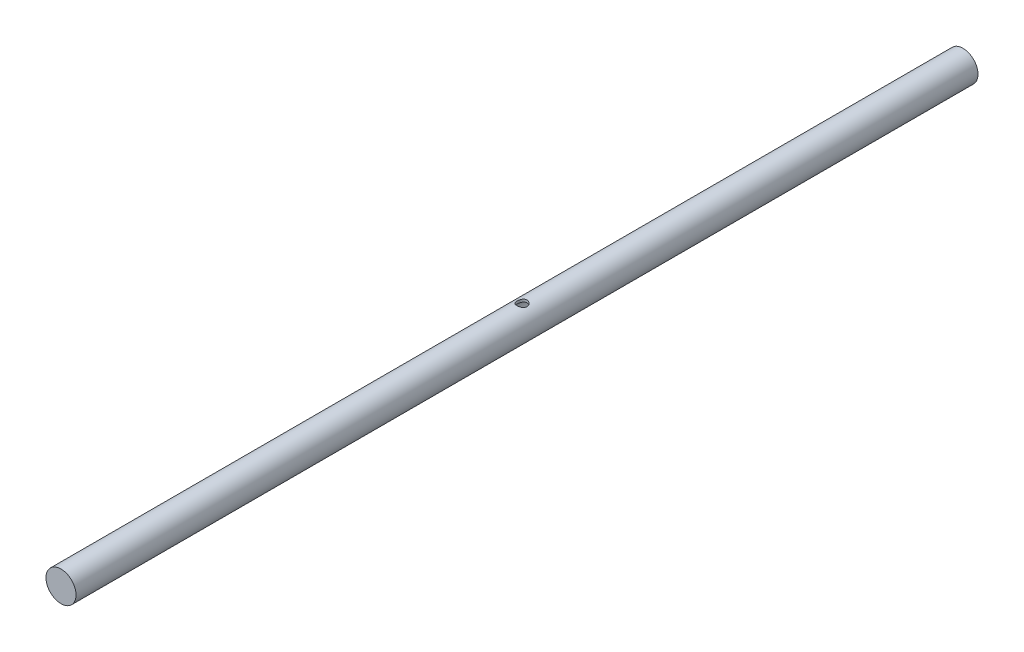
ISO-10303-21;
HEADER;
FILE_DESCRIPTION(('STEP AP214'),'2;1');
FILE_NAME('part.step','',(''),(''),'','','');
FILE_SCHEMA(('AUTOMOTIVE_DESIGN { 1 0 10303 214 1 1 1 1 }'));
ENDSEC;
DATA;
#1=APPLICATION_CONTEXT('core data for automotive mechanical design processes');
#2=APPLICATION_PROTOCOL_DEFINITION('international standard','automotive_design',2000,#1);
#3=PRODUCT_CONTEXT('',#1,'mechanical');
#4=PRODUCT('Part','Part','',(#3));
#5=PRODUCT_RELATED_PRODUCT_CATEGORY('part','',(#4));
#6=PRODUCT_DEFINITION_FORMATION('','',#4);
#7=PRODUCT_DEFINITION_CONTEXT('part definition',#1,'design');
#8=PRODUCT_DEFINITION('design','',#6,#7);
#9=PRODUCT_DEFINITION_SHAPE('','',#8);
#10=(LENGTH_UNIT() NAMED_UNIT(*) SI_UNIT(.MILLI.,.METRE.));
#11=(NAMED_UNIT(*) PLANE_ANGLE_UNIT() SI_UNIT($,.RADIAN.));
#12=(NAMED_UNIT(*) SI_UNIT($,.STERADIAN.) SOLID_ANGLE_UNIT());
#13=UNCERTAINTY_MEASURE_WITH_UNIT(LENGTH_MEASURE(1.E-05),#10,'distance_accuracy_value','');
#14=(GEOMETRIC_REPRESENTATION_CONTEXT(3) GLOBAL_UNCERTAINTY_ASSIGNED_CONTEXT((#13)) GLOBAL_UNIT_ASSIGNED_CONTEXT((#10,
#11,#12)) REPRESENTATION_CONTEXT('',''));
#15=CARTESIAN_POINT('',(0.,0.,0.));
#16=DIRECTION('',(0.,0.,1.));
#17=DIRECTION('',(1.,0.,0.));
#18=AXIS2_PLACEMENT_3D('',#15,#16,#17);
#19=CARTESIAN_POINT('',(0.,0.,228.6));
#20=DIRECTION('',(0.,0.,-1.));
#21=DIRECTION('',(-1.,0.,0.));
#22=AXIS2_PLACEMENT_3D('',#19,#20,#21);
#23=CYLINDRICAL_SURFACE('',#22,3.81);
#24=CARTESIAN_POINT('',(0.,0.,228.6));
#25=DIRECTION('',(0.,0.,1.));
#26=DIRECTION('',(1.,0.,0.));
#27=AXIS2_PLACEMENT_3D('',#24,#25,#26);
#28=CIRCLE('',#27,3.81);
#29=CARTESIAN_POINT('',(3.81,0.,228.6));
#30=VERTEX_POINT('',#29);
#31=EDGE_CURVE('E10',#30,#30,#28,.T.);
#32=ORIENTED_EDGE('',*,*,#31,.F.);
#33=EDGE_LOOP('',(#32));
#34=FACE_BOUND('',#33,.T.);
#35=CARTESIAN_POINT('',(0.,0.,0.));
#36=DIRECTION('',(0.,0.,1.));
#37=DIRECTION('',(1.,0.,0.));
#38=AXIS2_PLACEMENT_3D('',#35,#36,#37);
#39=CIRCLE('',#38,3.81);
#40=CARTESIAN_POINT('',(3.81,0.,0.));
#41=VERTEX_POINT('',#40);
#42=EDGE_CURVE('E43',#41,#41,#39,.T.);
#43=ORIENTED_EDGE('',*,*,#42,.T.);
#44=EDGE_LOOP('',(#43));
#45=FACE_BOUND('',#44,.T.);
#46=CARTESIAN_POINT('',(0.,3.81,110.49));
#47=CARTESIAN_POINT('',(-0.0692954708661389,3.81000019432199,110.489999677761));
#48=CARTESIAN_POINT('',(-0.138588997063959,3.80809207274582,110.495689937982));
#49=CARTESIAN_POINT('',(-0.275135036308676,3.80066816958166,110.518230968198));
#50=CARTESIAN_POINT('',(-0.3423873367109,3.79515201346734,110.535082896815));
#51=CARTESIAN_POINT('',(-0.472862642667256,3.78111141041182,110.579305439098));
#52=CARTESIAN_POINT('',(-0.536092178875263,3.77259199418184,110.606658469323));
#53=CARTESIAN_POINT('',(-0.657066169742762,3.75341446061024,110.671027289505));
#54=CARTESIAN_POINT('',(-0.714809539337557,3.74275592148078,110.708044985553));
#55=CARTESIAN_POINT('',(-0.825171927278282,3.72000899942616,110.792038772171));
#56=CARTESIAN_POINT('',(-0.877574699378859,3.70788636709006,110.839289667511));
#57=CARTESIAN_POINT('',(-0.973877519731653,3.68376599774564,110.941824286477));
#58=CARTESIAN_POINT('',(-1.01777569557162,3.67176828878997,110.997109774359));
#59=CARTESIAN_POINT('',(-1.09705767662939,3.64887932246137,111.1160910963));
#60=CARTESIAN_POINT('',(-1.13216036994072,3.63802979880123,111.17998304946));
#61=CARTESIAN_POINT('',(-1.19102996982472,3.61918637881623,111.313183639962));
#62=CARTESIAN_POINT('',(-1.2148003356812,3.61119161124147,111.382490616797));
#63=CARTESIAN_POINT('',(-1.24951929611664,3.59932355152109,111.522094991301));
#64=CARTESIAN_POINT('',(-1.26087307930515,3.59532041627406,111.592280254781));
#65=CARTESIAN_POINT('',(-1.27170322663479,3.59150483919474,111.733664967778));
#66=CARTESIAN_POINT('',(-1.27118326103799,3.59169110238867,111.804864097101));
#67=CARTESIAN_POINT('',(-1.25859527770334,3.59611949060389,111.942799520664));
#68=CARTESIAN_POINT('',(-1.24705606972208,3.60017588151767,112.009591071707));
#69=CARTESIAN_POINT('',(-1.21361982681876,3.6115835531018,112.140229642901));
#70=CARTESIAN_POINT('',(-1.19172155177168,3.61893522825817,112.204076309503));
#71=CARTESIAN_POINT('',(-1.13784260373647,3.63623747136686,112.328214191981));
#72=CARTESIAN_POINT('',(-1.10570524185822,3.64622798557259,112.388431592346));
#73=CARTESIAN_POINT('',(-1.03236916500499,3.66766549391172,112.502786053515));
#74=CARTESIAN_POINT('',(-0.991167832702291,3.67911290833888,112.556921351205));
#75=CARTESIAN_POINT('',(-0.898333652506452,3.70290508043031,112.660546329664));
#76=CARTESIAN_POINT('',(-0.846268500596929,3.7152654848065,112.709645922026));
#77=CARTESIAN_POINT('',(-0.734491253861994,3.73896811751536,112.798518708662));
#78=CARTESIAN_POINT('',(-0.674778426489242,3.75031024813345,112.838291008469));
#79=CARTESIAN_POINT('',(-0.54857346856876,3.77084727080998,112.907694301299));
#80=CARTESIAN_POINT('',(-0.482019961048746,3.7800197451021,112.937220774003));
#81=CARTESIAN_POINT('',(-0.344511735872921,3.79502120273432,112.984538030924));
#82=CARTESIAN_POINT('',(-0.273558556456788,3.80085134741697,113.002332891788));
#83=CARTESIAN_POINT('',(-0.132567463502212,3.80831886380729,113.024990695848));
#84=CARTESIAN_POINT('',(-0.0626231918283502,3.81012702328835,113.030380757649));
#85=CARTESIAN_POINT('',(0.0771843388495069,3.80985906422431,113.02957750453));
#86=CARTESIAN_POINT('',(0.147047609535962,3.8077836013259,113.023386144826));
#87=CARTESIAN_POINT('',(0.282600230206409,3.80009431390722,113.000012877175));
#88=CARTESIAN_POINT('',(0.348351864680254,3.79458472363214,112.983154518317));
#89=CARTESIAN_POINT('',(0.476067067396061,3.78068645474189,112.939330325527));
#90=CARTESIAN_POINT('',(0.538030151405935,3.77229740899277,112.912363202676));
#91=CARTESIAN_POINT('',(0.658226136419463,3.75321742734858,112.848300551562));
#92=CARTESIAN_POINT('',(0.716318048205781,3.74247174739848,112.81095726653));
#93=CARTESIAN_POINT('',(0.825582334272199,3.71989672473653,112.727493429483));
#94=CARTESIAN_POINT('',(0.876752587100389,3.70806705164161,112.68137019684));
#95=CARTESIAN_POINT('',(0.973140684914008,3.68397596935165,112.579176986222));
#96=CARTESIAN_POINT('',(1.01798243094213,3.67171936581033,112.522750281803));
#97=CARTESIAN_POINT('',(1.09760705335094,3.6487096608428,112.40291010888));
#98=CARTESIAN_POINT('',(1.13238984587239,3.63795657195143,112.339496582135));
#99=CARTESIAN_POINT('',(1.19074810162878,3.61927637575057,112.207455270582));
#100=CARTESIAN_POINT('',(1.21434622784958,3.61134356207083,112.138838359456));
#101=CARTESIAN_POINT('',(1.24954622678439,3.59931757029191,111.998279114444));
#102=CARTESIAN_POINT('',(1.26115350379151,3.59522266252022,111.926338293936));
#103=CARTESIAN_POINT('',(1.27162087874623,3.59153280770205,111.785149688028));
#104=CARTESIAN_POINT('',(1.27110522678167,3.59171748326917,111.715953427836));
#105=CARTESIAN_POINT('',(1.25887771267984,3.59602112676311,111.578688354849));
#106=CARTESIAN_POINT('',(1.24716651691241,3.60013986053089,111.510619475197));
#107=CARTESIAN_POINT('',(1.21332220267427,3.61168345867212,111.378827707987));
#108=CARTESIAN_POINT('',(1.19139124943971,3.61904404488546,111.315046832244));
#109=CARTESIAN_POINT('',(1.13789379451488,3.63621826499455,111.192021193188));
#110=CARTESIAN_POINT('',(1.10632515406334,3.64603244329509,111.132777440391));
#111=CARTESIAN_POINT('',(1.03284107958096,3.66754193117078,111.017705739198));
#112=CARTESIAN_POINT('',(0.990534268311023,3.67930063785514,110.962139642589));
#113=CARTESIAN_POINT('',(0.897436461582278,3.70310862479731,110.858693937002));
#114=CARTESIAN_POINT('',(0.846643067253385,3.71515798638713,110.810816508876));
#115=CARTESIAN_POINT('',(0.735636777289276,3.73875338767441,110.722226596393));
#116=CARTESIAN_POINT('',(0.675133922144658,3.75026150887596,110.681866078356));
#117=CARTESIAN_POINT('',(0.547823843906417,3.77096008789217,110.61193215536));
#118=CARTESIAN_POINT('',(0.481018238028086,3.78015113803071,110.582355992679));
#119=CARTESIAN_POINT('',(0.346066931945243,3.79483004137048,110.536073526739));
#120=CARTESIAN_POINT('',(0.278114452249042,3.80046499776604,110.518851267846));
#121=CARTESIAN_POINT('',(0.140106928333016,3.80804936971562,110.49581624354));
#122=CARTESIAN_POINT('',(0.0700524704723089,3.80999980355519,110.490000325759));
#123=CARTESIAN_POINT('',(0.,3.81,110.49));
#124=B_SPLINE_CURVE_WITH_KNOTS('',3,(#46,#47,#48,#49,#50,#51,#52,#53,#54,#55,#56,#57,#58,#59,
#60,#61,#62,#63,#64,#65,#66,#67,#68,#69,#70,#71,#72,#73,#74,#75,#76,#77,#78,#79,#80,#81,#82,#83,
#84,#85,#86,#87,#88,#89,#90,#91,#92,#93,#94,#95,#96,#97,#98,#99,#100,#101,#102,#103,#104,#105,
#106,#107,#108,#109,#110,#111,#112,#113,#114,#115,#116,#117,#118,#119,#120,#121,#122,#123),
.UNSPECIFIED.,.T.,.F.,(4,2,2,2,2,2,2,2,2,2,2,2,2,2,2,2,2,2,2,2,2,2,2,2,2,2,2,2,2,2,2,2,2,2,2,2,
2,2,4),(0.,0.207628624653035,0.415278805289754,0.622582794545249,0.829927699804859,
1.04374549039101,1.25761030275164,1.47762448725809,1.697571467599,1.9101044569214,
2.12257175164109,2.32532969720129,2.52811192186463,2.73415977367016,2.94026720248923,
3.15713498380434,3.37402355377606,3.59306375175955,3.81202779474056,4.02150050632467,
4.23093785718505,4.43430860632332,4.63770529510813,4.84645207801547,5.05526269643803,
5.27356099058557,5.49186110458446,5.70971697559999,5.9274746157642,6.1340449590161,
6.34060300776247,6.54323795592131,6.74591790483493,6.95744184698593,7.169025681272,
7.38885569260579,7.60862945063621,7.81858429134745,8.02848109868439),.UNSPECIFIED.);
#125=CARTESIAN_POINT('',(0.,3.81,110.49));
#126=VERTEX_POINT('',#125);
#127=EDGE_CURVE('E53',#126,#126,#124,.T.);
#128=ORIENTED_EDGE('',*,*,#127,.F.);
#129=EDGE_LOOP('',(#128));
#130=FACE_BOUND('',#129,.T.);
#131=ADVANCED_FACE('F31',(#34,#45,#130),#23,.T.);
#132=CARTESIAN_POINT('',(0.,0.,228.6));
#133=DIRECTION('',(0.,0.,-1.));
#134=DIRECTION('',(-1.,0.,0.));
#135=AXIS2_PLACEMENT_3D('',#132,#133,#134);
#136=CYLINDRICAL_SURFACE('',#135,3.175);
#137=CARTESIAN_POINT('',(0.,0.,0.));
#138=DIRECTION('',(0.,0.,1.));
#139=DIRECTION('',(1.,0.,0.));
#140=AXIS2_PLACEMENT_3D('',#137,#138,#139);
#141=CIRCLE('',#140,3.175);
#142=CARTESIAN_POINT('',(3.175,0.,0.));
#143=VERTEX_POINT('',#142);
#144=EDGE_CURVE('E50',#143,#143,#141,.T.);
#145=ORIENTED_EDGE('',*,*,#144,.F.);
#146=EDGE_LOOP('',(#145));
#147=FACE_BOUND('',#146,.T.);
#148=CARTESIAN_POINT('',(0.,0.,227.965));
#149=DIRECTION('',(0.,0.,1.));
#150=DIRECTION('',(1.,0.,0.));
#151=AXIS2_PLACEMENT_3D('',#148,#149,#150);
#152=CIRCLE('',#151,3.175);
#153=CARTESIAN_POINT('',(3.175,0.,227.965));
#154=VERTEX_POINT('',#153);
#155=EDGE_CURVE('E48',#154,#154,#152,.T.);
#156=ORIENTED_EDGE('',*,*,#155,.T.);
#157=EDGE_LOOP('',(#156));
#158=FACE_BOUND('',#157,.T.);
#159=CARTESIAN_POINT('',(0.,3.175,110.49));
#160=CARTESIAN_POINT('',(-0.0682580584562358,3.17499537229199,110.490006255908));
#161=CARTESIAN_POINT('',(-0.136634578197577,3.17277301884902,110.495535772576));
#162=CARTESIAN_POINT('',(-0.271460265065364,3.16409992718907,110.517462291736));
#163=CARTESIAN_POINT('',(-0.337903678751394,3.15763769473787,110.53388883722));
#164=CARTESIAN_POINT('',(-0.466695740931904,3.1411812285033,110.576916309567));
#165=CARTESIAN_POINT('',(-0.529057020126772,3.13119856591186,110.603483927348));
#166=CARTESIAN_POINT('',(-0.648380701158516,3.10868447855509,110.665907175062));
#167=CARTESIAN_POINT('',(-0.705344967736882,3.09615393885866,110.701759580874));
#168=CARTESIAN_POINT('',(-0.815023139807205,3.06915112718216,110.783519541586));
#169=CARTESIAN_POINT('',(-0.867449543069393,3.05461858550036,110.829792726713));
#170=CARTESIAN_POINT('',(-0.964041128038306,3.02552466335433,110.930309002208));
#171=CARTESIAN_POINT('',(-1.0082022680298,3.01096327228158,110.984555968729));
#172=CARTESIAN_POINT('',(-1.08894535023098,2.98273972791181,111.102411824604));
#173=CARTESIAN_POINT('',(-1.12510251305913,2.96914643637744,111.166329918625));
#174=CARTESIAN_POINT('',(-1.18602424658859,2.94534365963613,111.299965612997));
#175=CARTESIAN_POINT('',(-1.21079422832151,2.93513256790052,111.369680440184));
#176=CARTESIAN_POINT('',(-1.24707575285638,2.9198973711462,111.509627331831));
#177=CARTESIAN_POINT('',(-1.25913766828659,2.91465901925809,111.579692534591));
#178=CARTESIAN_POINT('',(-1.27137983064142,2.90934142571206,111.721033223925));
#179=CARTESIAN_POINT('',(-1.2715659203589,2.90925964706958,111.792308098087));
#180=CARTESIAN_POINT('',(-1.26046824836539,2.91408167677796,111.928755486376));
#181=CARTESIAN_POINT('',(-1.24998182458376,2.91863891149416,111.99400747865));
#182=CARTESIAN_POINT('',(-1.21916626898912,2.93164379130976,112.121733818064));
#183=CARTESIAN_POINT('',(-1.19883541970094,2.94009211524262,112.18420767845));
#184=CARTESIAN_POINT('',(-1.14852115516993,2.96011273031217,112.306111325984));
#185=CARTESIAN_POINT('',(-1.11834921257023,2.971745258433,112.3654529668));
#186=CARTESIAN_POINT('',(-1.04934160256496,2.9968070390758,112.47844904339));
#187=CARTESIAN_POINT('',(-1.01050268123904,3.01023696565099,112.532101331971));
#188=CARTESIAN_POINT('',(-0.921734630653571,3.03864477831342,112.636560177789));
#189=CARTESIAN_POINT('',(-0.871180288986358,3.05366207259856,112.686826143198));
#190=CARTESIAN_POINT('',(-0.762199661418174,3.08266988848509,112.778339643531));
#191=CARTESIAN_POINT('',(-0.703771811487364,3.09666020522781,112.819585382356));
#192=CARTESIAN_POINT('',(-0.579169309404706,3.12238822602988,112.892597079109));
#193=CARTESIAN_POINT('',(-0.51286441200501,3.13407596510588,112.92415964856));
#194=CARTESIAN_POINT('',(-0.375300091081632,3.15350415988762,112.975496591785));
#195=CARTESIAN_POINT('',(-0.304043204999547,3.16124662048613,112.995276953849));
#196=CARTESIAN_POINT('',(-0.163128888630971,3.17154648586888,113.021394667592));
#197=CARTESIAN_POINT('',(-0.0936264916808184,3.17438370604281,113.028458508451));
#198=CARTESIAN_POINT('',(0.0456217717279634,3.17543483854251,113.031087818836));
#199=CARTESIAN_POINT('',(0.115367570397193,3.17364994924755,113.026656268783));
#200=CARTESIAN_POINT('',(0.249829789342465,3.16584055085483,113.006954737129));
#201=CARTESIAN_POINT('',(0.314631382277429,3.16001013504407,112.992180682477));
#202=CARTESIAN_POINT('',(0.440775996818597,3.14489745292492,112.952888325223));
#203=CARTESIAN_POINT('',(0.502118572992777,3.13561474321397,112.92836877091));
#204=CARTESIAN_POINT('',(0.621715028993605,3.11414537679465,112.869481563303));
#205=CARTESIAN_POINT('',(0.679817044449682,3.10187858147175,112.834835625253));
#206=CARTESIAN_POINT('',(0.789586680441563,3.07577086613408,112.75698789432));
#207=CARTESIAN_POINT('',(0.841251708883316,3.06192931625022,112.713782672744));
#208=CARTESIAN_POINT('',(0.940259132323301,3.03304649700201,112.616697541777));
#209=CARTESIAN_POINT('',(0.987090947966852,3.01798635304908,112.562301201144));
#210=CARTESIAN_POINT('',(1.07108701035771,2.98920962302379,112.446155547289));
#211=CARTESIAN_POINT('',(1.10824966394932,2.97549325859334,112.384405024784));
#212=CARTESIAN_POINT('',(1.17208776372659,2.95093580441395,112.254371823933));
#213=CARTESIAN_POINT('',(1.19865812752938,2.9401238561184,112.1860316605));
#214=CARTESIAN_POINT('',(1.23970809951287,2.92305532658486,112.045284131161));
#215=CARTESIAN_POINT('',(1.25419663134602,2.91679538366959,111.972879809309));
#216=CARTESIAN_POINT('',(1.26981941697179,2.91002567155453,111.831673782373));
#217=CARTESIAN_POINT('',(1.27183964726232,2.90913452340189,111.762987776858));
#218=CARTESIAN_POINT('',(1.26479500614123,2.91220420881017,111.626304015352));
#219=CARTESIAN_POINT('',(1.25573154232525,2.91616442626244,111.558306173072));
#220=CARTESIAN_POINT('',(1.22750031750757,2.92815422165178,111.427684059442));
#221=CARTESIAN_POINT('',(1.20874630841757,2.9360166821043,111.364953625735));
#222=CARTESIAN_POINT('',(1.16205345979179,2.95480740782762,111.243504570195));
#223=CARTESIAN_POINT('',(1.13411208368507,2.96573651965814,111.184787061719));
#224=CARTESIAN_POINT('',(1.06798920435243,2.99020617098852,111.069367891763));
#225=CARTESIAN_POINT('',(1.02931298782627,3.00386040268909,111.012974144467));
#226=CARTESIAN_POINT('',(0.943541495737397,3.03189515776371,110.907199243576));
#227=CARTESIAN_POINT('',(0.896443682609505,3.04627589910738,110.857820211699));
#228=CARTESIAN_POINT('',(0.791530996483013,3.07526415100495,110.764191188178));
#229=CARTESIAN_POINT('',(0.733219260727799,3.08982591305988,110.72048131012));
#230=CARTESIAN_POINT('',(0.609536703381475,3.1165825826321,110.643455977935));
#231=CARTESIAN_POINT('',(0.544162617887502,3.12877638843995,110.610145357783));
#232=CARTESIAN_POINT('',(0.409408669684461,3.14921718908072,110.555644893354));
#233=CARTESIAN_POINT('',(0.340126077569512,3.15753345539943,110.534240879539));
#234=CARTESIAN_POINT('',(0.198676606888578,3.16956634442947,110.503564158194));
#235=CARTESIAN_POINT('',(0.126519638920411,3.1732975617973,110.494252952668));
#236=CARTESIAN_POINT('',(0.0361393091607404,3.17484696185127,110.490383933079));
#237=CARTESIAN_POINT('',(0.0180738073503816,3.17500122535427,110.48999834352));
#238=CARTESIAN_POINT('',(0.,3.175,110.49));
#239=B_SPLINE_CURVE_WITH_KNOTS('',3,(#159,#160,#161,#162,#163,#164,#165,#166,#167,#168,#169,
#170,#171,#172,#173,#174,#175,#176,#177,#178,#179,#180,#181,#182,#183,#184,#185,#186,#187,#188,
#189,#190,#191,#192,#193,#194,#195,#196,#197,#198,#199,#200,#201,#202,#203,#204,#205,#206,#207,
#208,#209,#210,#211,#212,#213,#214,#215,#216,#217,#218,#219,#220,#221,#222,#223,#224,#225,#226,
#227,#228,#229,#230,#231,#232,#233,#234,#235,#236,#237,#238),.UNSPECIFIED.,.T.,.F.,(4,2,2,2,2,2,
2,2,2,2,2,2,2,2,2,2,2,2,2,2,2,2,2,2,2,2,2,2,2,2,2,2,2,2,2,2,2,2,2,4),(0.,0.2047258973121,
0.410009108865039,0.614623775494461,0.819167485156698,1.03249337379753,1.24592330783353,
1.46885189350203,1.691674436801,1.90439106871107,2.11700304526211,2.31481838534873,
2.51266824907591,2.71455595199748,2.91651957930747,3.13409551733464,3.35171473953232,
3.57363339858383,3.79543917132257,4.00411432175285,4.21273537417003,4.41198289283374,
4.61125601111062,4.81662431007897,5.02207504281846,5.24108981386503,5.46014064842781,
5.68131353664427,5.90232292130171,6.10742792604397,6.31250688577535,6.50947592278471,
6.7064993873628,6.91480372216003,7.12317092856232,7.34504768943987,7.56702743411739,
7.78487331143459,8.00202395276759,8.05623259144467),.UNSPECIFIED.);
#240=CARTESIAN_POINT('',(0.,3.175,110.49));
#241=VERTEX_POINT('',#240);
#242=EDGE_CURVE('E35',#241,#241,#239,.T.);
#243=ORIENTED_EDGE('',*,*,#242,.T.);
#244=EDGE_LOOP('',(#243));
#245=FACE_BOUND('',#244,.T.);
#246=ADVANCED_FACE('F64',(#147,#158,#245),#136,.F.);
#247=CARTESIAN_POINT('',(0.,0.,228.6));
#248=DIRECTION('',(0.,0.,1.));
#249=DIRECTION('',(1.,0.,0.));
#250=AXIS2_PLACEMENT_3D('',#247,#248,#249);
#251=PLANE('',#250);
#252=ORIENTED_EDGE('',*,*,#31,.T.);
#253=EDGE_LOOP('',(#252));
#254=FACE_BOUND('',#253,.T.);
#255=ADVANCED_FACE('F69',(#254),#251,.T.);
#256=CARTESIAN_POINT('',(0.,0.,0.));
#257=DIRECTION('',(0.,0.,1.));
#258=DIRECTION('',(1.,0.,0.));
#259=AXIS2_PLACEMENT_3D('',#256,#257,#258);
#260=PLANE('',#259);
#261=ORIENTED_EDGE('',*,*,#144,.T.);
#262=EDGE_LOOP('',(#261));
#263=FACE_BOUND('',#262,.T.);
#264=ORIENTED_EDGE('',*,*,#42,.F.);
#265=EDGE_LOOP('',(#264));
#266=FACE_BOUND('',#265,.T.);
#267=ADVANCED_FACE('F73',(#263,#266),#260,.F.);
#268=CARTESIAN_POINT('',(0.,0.,227.965));
#269=DIRECTION('',(0.,0.,1.));
#270=DIRECTION('',(1.,0.,0.));
#271=AXIS2_PLACEMENT_3D('',#268,#269,#270);
#272=PLANE('',#271);
#273=ORIENTED_EDGE('',*,*,#155,.F.);
#274=EDGE_LOOP('',(#273));
#275=FACE_BOUND('',#274,.T.);
#276=ADVANCED_FACE('F62',(#275),#272,.F.);
#277=CARTESIAN_POINT('',(0.,5.08,111.76));
#278=DIRECTION('',(0.,-1.,0.));
#279=DIRECTION('',(0.,0.,-1.));
#280=AXIS2_PLACEMENT_3D('',#277,#278,#279);
#281=CYLINDRICAL_SURFACE('',#280,1.27);
#282=ORIENTED_EDGE('',*,*,#242,.F.);
#283=EDGE_LOOP('',(#282));
#284=FACE_BOUND('',#283,.T.);
#285=ORIENTED_EDGE('',*,*,#127,.T.);
#286=EDGE_LOOP('',(#285));
#287=FACE_BOUND('',#286,.T.);
#288=ADVANCED_FACE('F59',(#284,#287),#281,.F.);
#289=CLOSED_SHELL('',(#131,#246,#255,#267,#276,#288));
#290=MANIFOLD_SOLID_BREP('B2',#289);
#291=ADVANCED_BREP_SHAPE_REPRESENTATION('',(#18,#290),#14);
#292=SHAPE_DEFINITION_REPRESENTATION(#9,#291);
ENDSEC;
END-ISO-10303-21;
